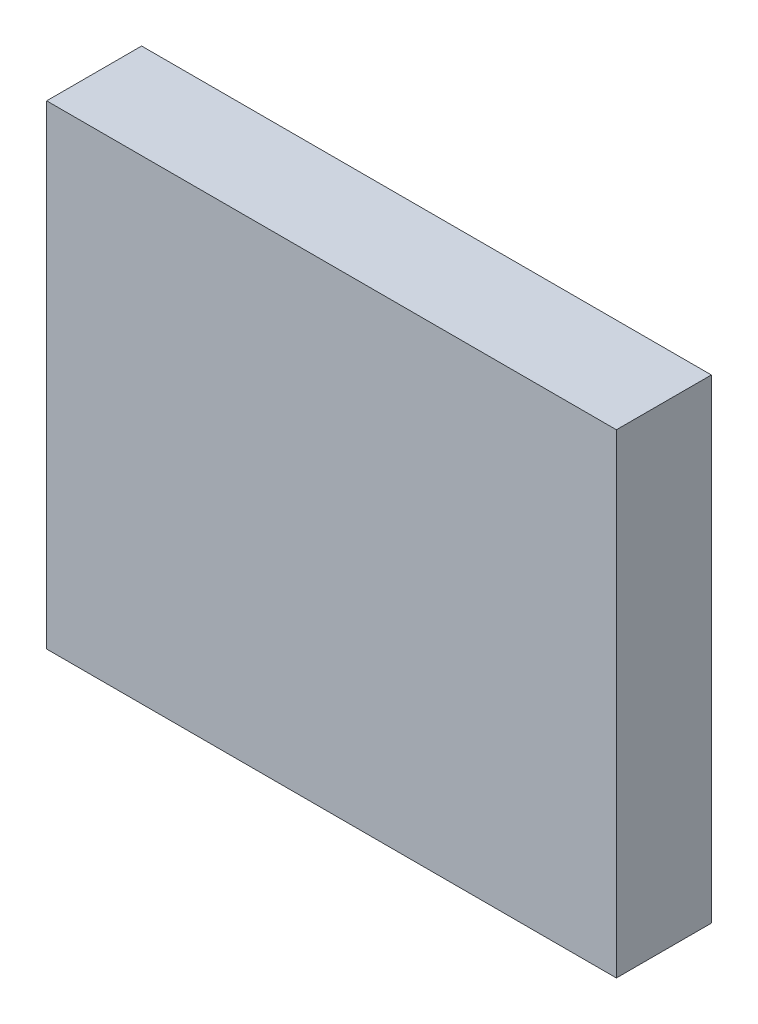
ISO-10303-21;
HEADER;
FILE_DESCRIPTION(('STEP AP214'),'2;1');
FILE_NAME('part.step','',(''),(''),'','','');
FILE_SCHEMA(('AUTOMOTIVE_DESIGN { 1 0 10303 214 1 1 1 1 }'));
ENDSEC;
DATA;
#1=APPLICATION_CONTEXT('core data for automotive mechanical design processes');
#2=APPLICATION_PROTOCOL_DEFINITION('international standard','automotive_design',2000,#1);
#3=PRODUCT_CONTEXT('',#1,'mechanical');
#4=PRODUCT('Part','Part','',(#3));
#5=PRODUCT_RELATED_PRODUCT_CATEGORY('part','',(#4));
#6=PRODUCT_DEFINITION_FORMATION('','',#4);
#7=PRODUCT_DEFINITION_CONTEXT('part definition',#1,'design');
#8=PRODUCT_DEFINITION('design','',#6,#7);
#9=PRODUCT_DEFINITION_SHAPE('','',#8);
#10=(LENGTH_UNIT() NAMED_UNIT(*) SI_UNIT(.MILLI.,.METRE.));
#11=(NAMED_UNIT(*) PLANE_ANGLE_UNIT() SI_UNIT($,.RADIAN.));
#12=(NAMED_UNIT(*) SI_UNIT($,.STERADIAN.) SOLID_ANGLE_UNIT());
#13=UNCERTAINTY_MEASURE_WITH_UNIT(LENGTH_MEASURE(1.E-05),#10,'distance_accuracy_value','');
#14=(GEOMETRIC_REPRESENTATION_CONTEXT(3) GLOBAL_UNCERTAINTY_ASSIGNED_CONTEXT((#13)) GLOBAL_UNIT_ASSIGNED_CONTEXT((#10,
#11,#12)) REPRESENTATION_CONTEXT('',''));
#15=CARTESIAN_POINT('',(0.,0.,0.));
#16=DIRECTION('',(0.,0.,1.));
#17=DIRECTION('',(1.,0.,0.));
#18=AXIS2_PLACEMENT_3D('',#15,#16,#17);
#19=CARTESIAN_POINT('',(30.,-25.,10.));
#20=DIRECTION('',(-1.,0.,0.));
#21=DIRECTION('',(0.,0.,1.));
#22=AXIS2_PLACEMENT_3D('',#19,#20,#21);
#23=PLANE('',#22);
#24=DIRECTION('',(0.,1.,0.));
#25=VECTOR('',#24,1.);
#26=CARTESIAN_POINT('',(30.,-25.,0.));
#27=LINE('',#26,#25);
#28=CARTESIAN_POINT('',(30.,-25.,0.));
#29=VERTEX_POINT('',#28);
#30=CARTESIAN_POINT('',(30.,25.,0.));
#31=VERTEX_POINT('',#30);
#32=EDGE_CURVE('E96',#29,#31,#27,.T.);
#33=ORIENTED_EDGE('',*,*,#32,.T.);
#34=DIRECTION('',(0.,0.,-1.));
#35=VECTOR('',#34,1.);
#36=CARTESIAN_POINT('',(30.,25.,10.));
#37=LINE('',#36,#35);
#38=CARTESIAN_POINT('',(30.,25.,10.));
#39=VERTEX_POINT('',#38);
#40=EDGE_CURVE('E11',#39,#31,#37,.T.);
#41=ORIENTED_EDGE('',*,*,#40,.F.);
#42=DIRECTION('',(0.,1.,0.));
#43=VECTOR('',#42,1.);
#44=CARTESIAN_POINT('',(30.,-25.,10.));
#45=LINE('',#44,#43);
#46=CARTESIAN_POINT('',(30.,-25.,10.));
#47=VERTEX_POINT('',#46);
#48=EDGE_CURVE('E84',#47,#39,#45,.T.);
#49=ORIENTED_EDGE('',*,*,#48,.F.);
#50=DIRECTION('',(0.,0.,-1.));
#51=VECTOR('',#50,1.);
#52=CARTESIAN_POINT('',(30.,-25.,10.));
#53=LINE('',#52,#51);
#54=EDGE_CURVE('E92',#47,#29,#53,.T.);
#55=ORIENTED_EDGE('',*,*,#54,.T.);
#56=EDGE_LOOP('',(#33,#41,#49,#55));
#57=FACE_BOUND('',#56,.T.);
#58=ADVANCED_FACE('F33',(#57),#23,.F.);
#59=CARTESIAN_POINT('',(-30.,25.,10.));
#60=DIRECTION('',(0.,-1.,0.));
#61=DIRECTION('',(0.,0.,-1.));
#62=AXIS2_PLACEMENT_3D('',#59,#60,#61);
#63=PLANE('',#62);
#64=DIRECTION('',(-1.,0.,0.));
#65=VECTOR('',#64,1.);
#66=CARTESIAN_POINT('',(-30.,25.,0.));
#67=LINE('',#66,#65);
#68=CARTESIAN_POINT('',(-30.,25.,0.));
#69=VERTEX_POINT('',#68);
#70=EDGE_CURVE('E88',#31,#69,#67,.T.);
#71=ORIENTED_EDGE('',*,*,#70,.T.);
#72=DIRECTION('',(0.,0.,-1.));
#73=VECTOR('',#72,1.);
#74=CARTESIAN_POINT('',(-30.,25.,10.));
#75=LINE('',#74,#73);
#76=CARTESIAN_POINT('',(-30.,25.,10.));
#77=VERTEX_POINT('',#76);
#78=EDGE_CURVE('E41',#77,#69,#75,.T.);
#79=ORIENTED_EDGE('',*,*,#78,.F.);
#80=DIRECTION('',(-1.,0.,0.));
#81=VECTOR('',#80,1.);
#82=CARTESIAN_POINT('',(-30.,25.,10.));
#83=LINE('',#82,#81);
#84=EDGE_CURVE('E79',#39,#77,#83,.T.);
#85=ORIENTED_EDGE('',*,*,#84,.F.);
#86=ORIENTED_EDGE('',*,*,#40,.T.);
#87=EDGE_LOOP('',(#71,#79,#85,#86));
#88=FACE_BOUND('',#87,.T.);
#89=ADVANCED_FACE('F87',(#88),#63,.F.);
#90=CARTESIAN_POINT('',(-30.,-25.,10.));
#91=DIRECTION('',(1.,0.,0.));
#92=DIRECTION('',(0.,0.,-1.));
#93=AXIS2_PLACEMENT_3D('',#90,#91,#92);
#94=PLANE('',#93);
#95=DIRECTION('',(0.,-1.,0.));
#96=VECTOR('',#95,1.);
#97=CARTESIAN_POINT('',(-30.,-25.,0.));
#98=LINE('',#97,#96);
#99=CARTESIAN_POINT('',(-30.,-25.,0.));
#100=VERTEX_POINT('',#99);
#101=EDGE_CURVE('E66',#69,#100,#98,.T.);
#102=ORIENTED_EDGE('',*,*,#101,.T.);
#103=DIRECTION('',(0.,0.,-1.));
#104=VECTOR('',#103,1.);
#105=CARTESIAN_POINT('',(-30.,-25.,10.));
#106=LINE('',#105,#104);
#107=CARTESIAN_POINT('',(-30.,-25.,10.));
#108=VERTEX_POINT('',#107);
#109=EDGE_CURVE('E89',#108,#100,#106,.T.);
#110=ORIENTED_EDGE('',*,*,#109,.F.);
#111=DIRECTION('',(0.,-1.,0.));
#112=VECTOR('',#111,1.);
#113=CARTESIAN_POINT('',(-30.,-25.,10.));
#114=LINE('',#113,#112);
#115=EDGE_CURVE('E82',#77,#108,#114,.T.);
#116=ORIENTED_EDGE('',*,*,#115,.F.);
#117=ORIENTED_EDGE('',*,*,#78,.T.);
#118=EDGE_LOOP('',(#102,#110,#116,#117));
#119=FACE_BOUND('',#118,.T.);
#120=ADVANCED_FACE('F90',(#119),#94,.F.);
#121=CARTESIAN_POINT('',(-30.,-25.,10.));
#122=DIRECTION('',(0.,1.,0.));
#123=DIRECTION('',(0.,0.,1.));
#124=AXIS2_PLACEMENT_3D('',#121,#122,#123);
#125=PLANE('',#124);
#126=DIRECTION('',(1.,0.,0.));
#127=VECTOR('',#126,1.);
#128=CARTESIAN_POINT('',(-30.,-25.,0.));
#129=LINE('',#128,#127);
#130=EDGE_CURVE('E72',#100,#29,#129,.T.);
#131=ORIENTED_EDGE('',*,*,#130,.T.);
#132=ORIENTED_EDGE('',*,*,#54,.F.);
#133=DIRECTION('',(1.,0.,0.));
#134=VECTOR('',#133,1.);
#135=CARTESIAN_POINT('',(-30.,-25.,10.));
#136=LINE('',#135,#134);
#137=EDGE_CURVE('E49',#108,#47,#136,.T.);
#138=ORIENTED_EDGE('',*,*,#137,.F.);
#139=ORIENTED_EDGE('',*,*,#109,.T.);
#140=EDGE_LOOP('',(#131,#132,#138,#139));
#141=FACE_BOUND('',#140,.T.);
#142=ADVANCED_FACE('F103',(#141),#125,.F.);
#143=CARTESIAN_POINT('',(0.,0.,10.));
#144=DIRECTION('',(0.,0.,-1.));
#145=DIRECTION('',(-1.,0.,0.));
#146=AXIS2_PLACEMENT_3D('',#143,#144,#145);
#147=PLANE('',#146);
#148=ORIENTED_EDGE('',*,*,#48,.T.);
#149=ORIENTED_EDGE('',*,*,#84,.T.);
#150=ORIENTED_EDGE('',*,*,#115,.T.);
#151=ORIENTED_EDGE('',*,*,#137,.T.);
#152=EDGE_LOOP('',(#148,#149,#150,#151));
#153=FACE_BOUND('',#152,.T.);
#154=ADVANCED_FACE('F80',(#153),#147,.F.);
#155=CARTESIAN_POINT('',(0.,0.,0.));
#156=DIRECTION('',(0.,0.,-1.));
#157=DIRECTION('',(-1.,0.,0.));
#158=AXIS2_PLACEMENT_3D('',#155,#156,#157);
#159=PLANE('',#158);
#160=ORIENTED_EDGE('',*,*,#32,.F.);
#161=ORIENTED_EDGE('',*,*,#130,.F.);
#162=ORIENTED_EDGE('',*,*,#101,.F.);
#163=ORIENTED_EDGE('',*,*,#70,.F.);
#164=EDGE_LOOP('',(#160,#161,#162,#163));
#165=FACE_BOUND('',#164,.T.);
#166=ADVANCED_FACE('F106',(#165),#159,.T.);
#167=CLOSED_SHELL('',(#58,#89,#120,#142,#154,#166));
#168=MANIFOLD_SOLID_BREP('B2',#167);
#169=ADVANCED_BREP_SHAPE_REPRESENTATION('',(#18,#168),#14);
#170=SHAPE_DEFINITION_REPRESENTATION(#9,#169);
ENDSEC;
END-ISO-10303-21;
